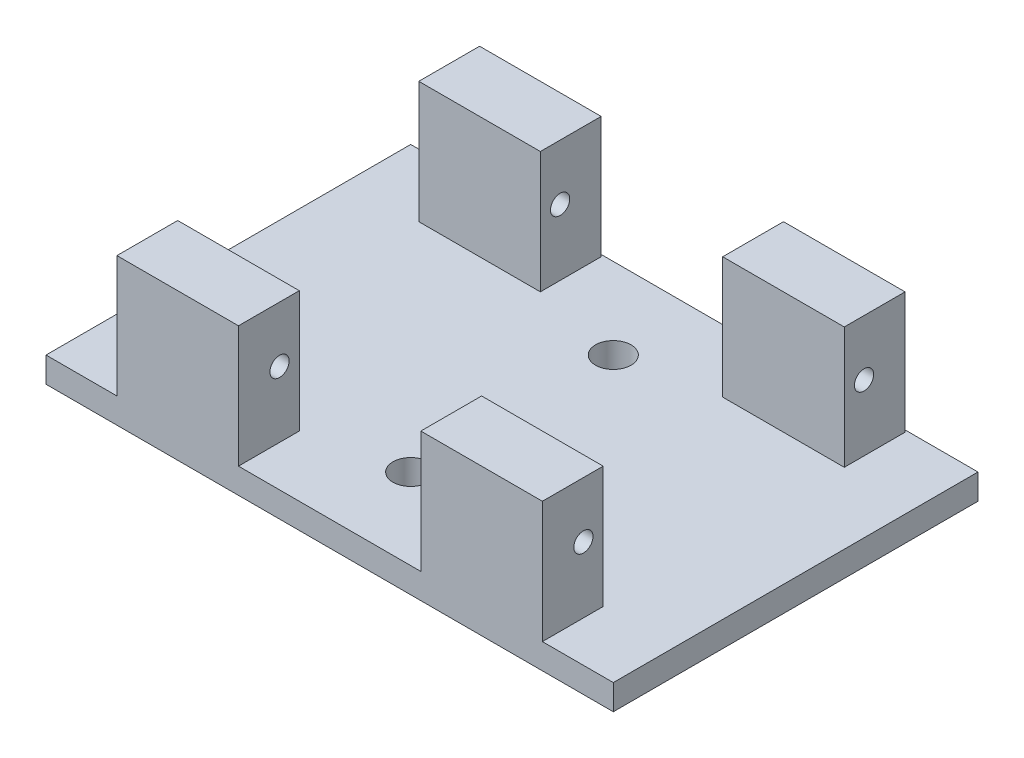
ISO-10303-21;
HEADER;
FILE_DESCRIPTION(('STEP AP214'),'2;1');
FILE_NAME('part.step','',(''),(''),'','','');
FILE_SCHEMA(('AUTOMOTIVE_DESIGN { 1 0 10303 214 1 1 1 1 }'));
ENDSEC;
DATA;
#1=APPLICATION_CONTEXT('core data for automotive mechanical design processes');
#2=APPLICATION_PROTOCOL_DEFINITION('international standard','automotive_design',2000,#1);
#3=PRODUCT_CONTEXT('',#1,'mechanical');
#4=PRODUCT('Part','Part','',(#3));
#5=PRODUCT_RELATED_PRODUCT_CATEGORY('part','',(#4));
#6=PRODUCT_DEFINITION_FORMATION('','',#4);
#7=PRODUCT_DEFINITION_CONTEXT('part definition',#1,'design');
#8=PRODUCT_DEFINITION('design','',#6,#7);
#9=PRODUCT_DEFINITION_SHAPE('','',#8);
#10=(LENGTH_UNIT() NAMED_UNIT(*) SI_UNIT(.MILLI.,.METRE.));
#11=(NAMED_UNIT(*) PLANE_ANGLE_UNIT() SI_UNIT($,.RADIAN.));
#12=(NAMED_UNIT(*) SI_UNIT($,.STERADIAN.) SOLID_ANGLE_UNIT());
#13=UNCERTAINTY_MEASURE_WITH_UNIT(LENGTH_MEASURE(1.E-05),#10,'distance_accuracy_value','');
#14=(GEOMETRIC_REPRESENTATION_CONTEXT(3) GLOBAL_UNCERTAINTY_ASSIGNED_CONTEXT((#13)) GLOBAL_UNIT_ASSIGNED_CONTEXT((#10,
#11,#12)) REPRESENTATION_CONTEXT('',''));
#15=CARTESIAN_POINT('',(0.,0.,0.));
#16=DIRECTION('',(0.,0.,1.));
#17=DIRECTION('',(1.,0.,0.));
#18=AXIS2_PLACEMENT_3D('',#15,#16,#17);
#19=CARTESIAN_POINT('',(0.,2.5,0.));
#20=DIRECTION('',(0.,1.,0.));
#21=DIRECTION('',(0.,0.,1.));
#22=AXIS2_PLACEMENT_3D('',#19,#20,#21);
#23=PLANE('',#22);
#24=CARTESIAN_POINT('',(0.,2.5,10.));
#25=DIRECTION('',(0.,1.,0.));
#26=DIRECTION('',(0.,0.,1.));
#27=AXIS2_PLACEMENT_3D('',#24,#25,#26);
#28=CIRCLE('',#27,1.75);
#29=CARTESIAN_POINT('',(0.,2.5,11.75));
#30=VERTEX_POINT('',#29);
#31=EDGE_CURVE('E691',#30,#30,#28,.T.);
#32=ORIENTED_EDGE('',*,*,#31,.F.);
#33=EDGE_LOOP('',(#32));
#34=FACE_BOUND('',#33,.T.);
#35=CARTESIAN_POINT('',(0.,2.5,-10.));
#36=DIRECTION('',(0.,1.,0.));
#37=DIRECTION('',(0.,0.,1.));
#38=AXIS2_PLACEMENT_3D('',#35,#36,#37);
#39=CIRCLE('',#38,1.75);
#40=CARTESIAN_POINT('',(0.,2.5,-8.25));
#41=VERTEX_POINT('',#40);
#42=EDGE_CURVE('E692',#41,#41,#39,.T.);
#43=ORIENTED_EDGE('',*,*,#42,.F.);
#44=EDGE_LOOP('',(#43));
#45=FACE_BOUND('',#44,.T.);
#46=DIRECTION('',(0.,0.,1.));
#47=VECTOR('',#46,1.);
#48=CARTESIAN_POINT('',(-9.,2.5,-17.8));
#49=LINE('',#48,#47);
#50=CARTESIAN_POINT('',(-9.,2.5,-17.8));
#51=VERTEX_POINT('',#50);
#52=CARTESIAN_POINT('',(-9.,2.5,-11.8));
#53=VERTEX_POINT('',#52);
#54=EDGE_CURVE('E183',#51,#53,#49,.T.);
#55=ORIENTED_EDGE('',*,*,#54,.T.);
#56=DIRECTION('',(-1.,0.,0.));
#57=VECTOR('',#56,1.);
#58=CARTESIAN_POINT('',(-9.,2.5,-11.8));
#59=LINE('',#58,#57);
#60=CARTESIAN_POINT('',(-21.,2.5,-11.8));
#61=VERTEX_POINT('',#60);
#62=EDGE_CURVE('E197',#53,#61,#59,.T.);
#63=ORIENTED_EDGE('',*,*,#62,.T.);
#64=DIRECTION('',(0.,0.,-1.));
#65=VECTOR('',#64,1.);
#66=CARTESIAN_POINT('',(-21.,2.5,-17.8));
#67=LINE('',#66,#65);
#68=CARTESIAN_POINT('',(-21.,2.5,-17.8));
#69=VERTEX_POINT('',#68);
#70=EDGE_CURVE('E61',#61,#69,#67,.T.);
#71=ORIENTED_EDGE('',*,*,#70,.T.);
#72=DIRECTION('',(1.,0.,0.));
#73=VECTOR('',#72,1.);
#74=CARTESIAN_POINT('',(-9.,2.5,-17.8));
#75=LINE('',#74,#73);
#76=EDGE_CURVE('E56',#69,#51,#75,.T.);
#77=ORIENTED_EDGE('',*,*,#76,.T.);
#78=EDGE_LOOP('',(#55,#63,#71,#77));
#79=FACE_BOUND('',#78,.T.);
#80=DIRECTION('',(0.,0.,1.));
#81=VECTOR('',#80,1.);
#82=CARTESIAN_POINT('',(-9.,2.5,12.));
#83=LINE('',#82,#81);
#84=CARTESIAN_POINT('',(-9.,2.5,12.));
#85=VERTEX_POINT('',#84);
#86=CARTESIAN_POINT('',(-9.,2.5,18.));
#87=VERTEX_POINT('',#86);
#88=EDGE_CURVE('E231',#85,#87,#83,.T.);
#89=ORIENTED_EDGE('',*,*,#88,.T.);
#90=DIRECTION('',(1.,0.,0.));
#91=VECTOR('',#90,1.);
#92=CARTESIAN_POINT('',(-28.,2.5,18.));
#93=LINE('',#92,#91);
#94=CARTESIAN_POINT('',(9.,2.5,18.));
#95=VERTEX_POINT('',#94);
#96=EDGE_CURVE('E331',#87,#95,#93,.T.);
#97=ORIENTED_EDGE('',*,*,#96,.T.);
#98=DIRECTION('',(0.,0.,1.));
#99=VECTOR('',#98,1.);
#100=CARTESIAN_POINT('',(9.,2.5,12.));
#101=LINE('',#100,#99);
#102=CARTESIAN_POINT('',(9.,2.5,12.));
#103=VERTEX_POINT('',#102);
#104=EDGE_CURVE('E275',#103,#95,#101,.T.);
#105=ORIENTED_EDGE('',*,*,#104,.F.);
#106=DIRECTION('',(-1.,0.,0.));
#107=VECTOR('',#106,1.);
#108=CARTESIAN_POINT('',(9.,2.5,12.));
#109=LINE('',#108,#107);
#110=CARTESIAN_POINT('',(21.,2.5,12.));
#111=VERTEX_POINT('',#110);
#112=EDGE_CURVE('E303',#111,#103,#109,.T.);
#113=ORIENTED_EDGE('',*,*,#112,.F.);
#114=DIRECTION('',(0.,0.,-1.));
#115=VECTOR('',#114,1.);
#116=CARTESIAN_POINT('',(21.,2.5,12.));
#117=LINE('',#116,#115);
#118=CARTESIAN_POINT('',(21.,2.5,18.));
#119=VERTEX_POINT('',#118);
#120=EDGE_CURVE('E306',#119,#111,#117,.T.);
#121=ORIENTED_EDGE('',*,*,#120,.F.);
#122=CARTESIAN_POINT('',(28.,2.5,18.));
#123=VERTEX_POINT('',#122);
#124=EDGE_CURVE('E327',#119,#123,#93,.T.);
#125=ORIENTED_EDGE('',*,*,#124,.T.);
#126=DIRECTION('',(0.,0.,-1.));
#127=VECTOR('',#126,1.);
#128=CARTESIAN_POINT('',(28.,2.5,-18.));
#129=LINE('',#128,#127);
#130=CARTESIAN_POINT('',(28.,2.5,-18.));
#131=VERTEX_POINT('',#130);
#132=EDGE_CURVE('E319',#123,#131,#129,.T.);
#133=ORIENTED_EDGE('',*,*,#132,.T.);
#134=DIRECTION('',(-1.,0.,0.));
#135=VECTOR('',#134,1.);
#136=CARTESIAN_POINT('',(-28.,2.5,-18.));
#137=LINE('',#136,#135);
#138=CARTESIAN_POINT('',(-28.,2.5,-18.));
#139=VERTEX_POINT('',#138);
#140=EDGE_CURVE('E322',#131,#139,#137,.T.);
#141=ORIENTED_EDGE('',*,*,#140,.T.);
#142=DIRECTION('',(0.,0.,1.));
#143=VECTOR('',#142,1.);
#144=CARTESIAN_POINT('',(-28.,2.5,-18.));
#145=LINE('',#144,#143);
#146=CARTESIAN_POINT('',(-28.,2.5,18.));
#147=VERTEX_POINT('',#146);
#148=EDGE_CURVE('E325',#139,#147,#145,.T.);
#149=ORIENTED_EDGE('',*,*,#148,.T.);
#150=CARTESIAN_POINT('',(-21.,2.5,18.));
#151=VERTEX_POINT('',#150);
#152=EDGE_CURVE('E328',#147,#151,#93,.T.);
#153=ORIENTED_EDGE('',*,*,#152,.T.);
#154=DIRECTION('',(0.,0.,-1.));
#155=VECTOR('',#154,1.);
#156=CARTESIAN_POINT('',(-21.,2.5,12.));
#157=LINE('',#156,#155);
#158=CARTESIAN_POINT('',(-21.,2.5,12.));
#159=VERTEX_POINT('',#158);
#160=EDGE_CURVE('E221',#151,#159,#157,.T.);
#161=ORIENTED_EDGE('',*,*,#160,.T.);
#162=DIRECTION('',(1.,0.,0.));
#163=VECTOR('',#162,1.);
#164=CARTESIAN_POINT('',(-9.,2.5,12.));
#165=LINE('',#164,#163);
#166=EDGE_CURVE('E234',#159,#85,#165,.T.);
#167=ORIENTED_EDGE('',*,*,#166,.T.);
#168=EDGE_LOOP('',(#89,#97,#105,#113,#121,#125,#133,#141,#149,#153,#161,#167));
#169=FACE_BOUND('',#168,.T.);
#170=DIRECTION('',(1.,0.,0.));
#171=VECTOR('',#170,1.);
#172=CARTESIAN_POINT('',(9.,2.5,-11.8));
#173=LINE('',#172,#171);
#174=CARTESIAN_POINT('',(9.,2.5,-11.8));
#175=VERTEX_POINT('',#174);
#176=CARTESIAN_POINT('',(21.,2.5,-11.8));
#177=VERTEX_POINT('',#176);
#178=EDGE_CURVE('E274',#175,#177,#173,.T.);
#179=ORIENTED_EDGE('',*,*,#178,.F.);
#180=DIRECTION('',(0.,0.,1.));
#181=VECTOR('',#180,1.);
#182=CARTESIAN_POINT('',(9.,2.5,-17.8));
#183=LINE('',#182,#181);
#184=CARTESIAN_POINT('',(9.,2.5,-17.8));
#185=VERTEX_POINT('',#184);
#186=EDGE_CURVE('E271',#185,#175,#183,.T.);
#187=ORIENTED_EDGE('',*,*,#186,.F.);
#188=DIRECTION('',(-1.,0.,0.));
#189=VECTOR('',#188,1.);
#190=CARTESIAN_POINT('',(9.,2.5,-17.8));
#191=LINE('',#190,#189);
#192=CARTESIAN_POINT('',(21.,2.5,-17.8));
#193=VERTEX_POINT('',#192);
#194=EDGE_CURVE('E264',#193,#185,#191,.T.);
#195=ORIENTED_EDGE('',*,*,#194,.F.);
#196=DIRECTION('',(0.,0.,-1.));
#197=VECTOR('',#196,1.);
#198=CARTESIAN_POINT('',(21.,2.5,-17.8));
#199=LINE('',#198,#197);
#200=EDGE_CURVE('E277',#177,#193,#199,.T.);
#201=ORIENTED_EDGE('',*,*,#200,.F.);
#202=EDGE_LOOP('',(#179,#187,#195,#201));
#203=FACE_BOUND('',#202,.T.);
#204=ADVANCED_FACE('F41',(#34,#45,#79,#169,#203),#23,.T.);
#205=CARTESIAN_POINT('',(28.,2.5,-18.));
#206=DIRECTION('',(-1.,0.,0.));
#207=DIRECTION('',(0.,0.,1.));
#208=AXIS2_PLACEMENT_3D('',#205,#206,#207);
#209=PLANE('',#208);
#210=DIRECTION('',(0.,0.,-1.));
#211=VECTOR('',#210,1.);
#212=CARTESIAN_POINT('',(28.,0.,-18.));
#213=LINE('',#212,#211);
#214=CARTESIAN_POINT('',(28.,0.,18.));
#215=VERTEX_POINT('',#214);
#216=CARTESIAN_POINT('',(28.,0.,-18.));
#217=VERTEX_POINT('',#216);
#218=EDGE_CURVE('E290',#215,#217,#213,.T.);
#219=ORIENTED_EDGE('',*,*,#218,.T.);
#220=DIRECTION('',(0.,-1.,0.));
#221=VECTOR('',#220,1.);
#222=CARTESIAN_POINT('',(28.,2.5,-18.));
#223=LINE('',#222,#221);
#224=EDGE_CURVE('E11',#131,#217,#223,.T.);
#225=ORIENTED_EDGE('',*,*,#224,.F.);
#226=ORIENTED_EDGE('',*,*,#132,.F.);
#227=DIRECTION('',(0.,-1.,0.));
#228=VECTOR('',#227,1.);
#229=CARTESIAN_POINT('',(28.,2.5,18.));
#230=LINE('',#229,#228);
#231=EDGE_CURVE('E330',#123,#215,#230,.T.);
#232=ORIENTED_EDGE('',*,*,#231,.T.);
#233=EDGE_LOOP('',(#219,#225,#226,#232));
#234=FACE_BOUND('',#233,.T.);
#235=ADVANCED_FACE('F43',(#234),#209,.F.);
#236=CARTESIAN_POINT('',(-28.,2.5,-18.));
#237=DIRECTION('',(0.,0.,1.));
#238=DIRECTION('',(1.,0.,0.));
#239=AXIS2_PLACEMENT_3D('',#236,#237,#238);
#240=PLANE('',#239);
#241=DIRECTION('',(-1.,0.,0.));
#242=VECTOR('',#241,1.);
#243=CARTESIAN_POINT('',(-28.,0.,-18.));
#244=LINE('',#243,#242);
#245=CARTESIAN_POINT('',(-28.,0.,-18.));
#246=VERTEX_POINT('',#245);
#247=EDGE_CURVE('E334',#217,#246,#244,.T.);
#248=ORIENTED_EDGE('',*,*,#247,.T.);
#249=DIRECTION('',(0.,-1.,0.));
#250=VECTOR('',#249,1.);
#251=CARTESIAN_POINT('',(-28.,2.5,-18.));
#252=LINE('',#251,#250);
#253=EDGE_CURVE('E49',#139,#246,#252,.T.);
#254=ORIENTED_EDGE('',*,*,#253,.F.);
#255=ORIENTED_EDGE('',*,*,#140,.F.);
#256=ORIENTED_EDGE('',*,*,#224,.T.);
#257=EDGE_LOOP('',(#248,#254,#255,#256));
#258=FACE_BOUND('',#257,.T.);
#259=ADVANCED_FACE('F401',(#258),#240,.F.);
#260=CARTESIAN_POINT('',(-28.,2.5,-18.));
#261=DIRECTION('',(1.,0.,0.));
#262=DIRECTION('',(0.,0.,-1.));
#263=AXIS2_PLACEMENT_3D('',#260,#261,#262);
#264=PLANE('',#263);
#265=DIRECTION('',(0.,0.,1.));
#266=VECTOR('',#265,1.);
#267=CARTESIAN_POINT('',(-28.,0.,-18.));
#268=LINE('',#267,#266);
#269=CARTESIAN_POINT('',(-28.,0.,18.));
#270=VERTEX_POINT('',#269);
#271=EDGE_CURVE('E336',#246,#270,#268,.T.);
#272=ORIENTED_EDGE('',*,*,#271,.T.);
#273=DIRECTION('',(0.,-1.,0.));
#274=VECTOR('',#273,1.);
#275=CARTESIAN_POINT('',(-28.,2.5,18.));
#276=LINE('',#275,#274);
#277=EDGE_CURVE('E341',#147,#270,#276,.T.);
#278=ORIENTED_EDGE('',*,*,#277,.F.);
#279=ORIENTED_EDGE('',*,*,#148,.F.);
#280=ORIENTED_EDGE('',*,*,#253,.T.);
#281=EDGE_LOOP('',(#272,#278,#279,#280));
#282=FACE_BOUND('',#281,.T.);
#283=ADVANCED_FACE('F348',(#282),#264,.F.);
#284=CARTESIAN_POINT('',(-28.,2.5,18.));
#285=DIRECTION('',(0.,0.,-1.));
#286=DIRECTION('',(-1.,0.,0.));
#287=AXIS2_PLACEMENT_3D('',#284,#285,#286);
#288=PLANE('',#287);
#289=DIRECTION('',(1.,0.,0.));
#290=VECTOR('',#289,1.);
#291=CARTESIAN_POINT('',(-28.,0.,18.));
#292=LINE('',#291,#290);
#293=EDGE_CURVE('E323',#270,#215,#292,.T.);
#294=ORIENTED_EDGE('',*,*,#293,.T.);
#295=ORIENTED_EDGE('',*,*,#231,.F.);
#296=ORIENTED_EDGE('',*,*,#124,.F.);
#297=DIRECTION('',(0.,-1.,0.));
#298=VECTOR('',#297,1.);
#299=CARTESIAN_POINT('',(21.,14.5,18.));
#300=LINE('',#299,#298);
#301=CARTESIAN_POINT('',(21.,14.5,18.));
#302=VERTEX_POINT('',#301);
#303=EDGE_CURVE('E293',#302,#119,#300,.T.);
#304=ORIENTED_EDGE('',*,*,#303,.F.);
#305=DIRECTION('',(1.,0.,0.));
#306=VECTOR('',#305,1.);
#307=CARTESIAN_POINT('',(9.,14.5,18.));
#308=LINE('',#307,#306);
#309=CARTESIAN_POINT('',(9.,14.5,18.));
#310=VERTEX_POINT('',#309);
#311=EDGE_CURVE('E315',#310,#302,#308,.T.);
#312=ORIENTED_EDGE('',*,*,#311,.F.);
#313=DIRECTION('',(0.,-1.,0.));
#314=VECTOR('',#313,1.);
#315=CARTESIAN_POINT('',(9.,14.5,18.));
#316=LINE('',#315,#314);
#317=EDGE_CURVE('E259',#310,#95,#316,.T.);
#318=ORIENTED_EDGE('',*,*,#317,.T.);
#319=ORIENTED_EDGE('',*,*,#96,.F.);
#320=DIRECTION('',(0.,-1.,0.));
#321=VECTOR('',#320,1.);
#322=CARTESIAN_POINT('',(-9.,14.5,18.));
#323=LINE('',#322,#321);
#324=CARTESIAN_POINT('',(-9.,14.5,18.));
#325=VERTEX_POINT('',#324);
#326=EDGE_CURVE('E230',#325,#87,#323,.T.);
#327=ORIENTED_EDGE('',*,*,#326,.F.);
#328=DIRECTION('',(-1.,0.,0.));
#329=VECTOR('',#328,1.);
#330=CARTESIAN_POINT('',(-9.,14.5,18.));
#331=LINE('',#330,#329);
#332=CARTESIAN_POINT('',(-21.,14.5,18.));
#333=VERTEX_POINT('',#332);
#334=EDGE_CURVE('E227',#325,#333,#331,.T.);
#335=ORIENTED_EDGE('',*,*,#334,.T.);
#336=DIRECTION('',(0.,-1.,0.));
#337=VECTOR('',#336,1.);
#338=CARTESIAN_POINT('',(-21.,14.5,18.));
#339=LINE('',#338,#337);
#340=EDGE_CURVE('E240',#333,#151,#339,.T.);
#341=ORIENTED_EDGE('',*,*,#340,.T.);
#342=ORIENTED_EDGE('',*,*,#152,.F.);
#343=ORIENTED_EDGE('',*,*,#277,.T.);
#344=EDGE_LOOP('',(#294,#295,#296,#304,#312,#318,#319,#327,#335,#341,#342,#343));
#345=FACE_BOUND('',#344,.T.);
#346=ADVANCED_FACE('F357',(#345),#288,.F.);
#347=CARTESIAN_POINT('',(0.,0.,0.));
#348=DIRECTION('',(0.,1.,0.));
#349=DIRECTION('',(0.,0.,1.));
#350=AXIS2_PLACEMENT_3D('',#347,#348,#349);
#351=PLANE('',#350);
#352=CARTESIAN_POINT('',(0.,0.,10.));
#353=DIRECTION('',(0.,1.,0.));
#354=DIRECTION('',(0.,0.,1.));
#355=AXIS2_PLACEMENT_3D('',#352,#353,#354);
#356=CIRCLE('',#355,1.75);
#357=CARTESIAN_POINT('',(0.,0.,11.75));
#358=VERTEX_POINT('',#357);
#359=EDGE_CURVE('E689',#358,#358,#356,.T.);
#360=ORIENTED_EDGE('',*,*,#359,.T.);
#361=EDGE_LOOP('',(#360));
#362=FACE_BOUND('',#361,.T.);
#363=CARTESIAN_POINT('',(0.,0.,-10.));
#364=DIRECTION('',(0.,1.,0.));
#365=DIRECTION('',(0.,0.,1.));
#366=AXIS2_PLACEMENT_3D('',#363,#364,#365);
#367=CIRCLE('',#366,1.75);
#368=CARTESIAN_POINT('',(0.,0.,-8.25));
#369=VERTEX_POINT('',#368);
#370=EDGE_CURVE('E697',#369,#369,#367,.T.);
#371=ORIENTED_EDGE('',*,*,#370,.T.);
#372=EDGE_LOOP('',(#371));
#373=FACE_BOUND('',#372,.T.);
#374=ORIENTED_EDGE('',*,*,#218,.F.);
#375=ORIENTED_EDGE('',*,*,#293,.F.);
#376=ORIENTED_EDGE('',*,*,#271,.F.);
#377=ORIENTED_EDGE('',*,*,#247,.F.);
#378=EDGE_LOOP('',(#374,#375,#376,#377));
#379=FACE_BOUND('',#378,.T.);
#380=ADVANCED_FACE('F354',(#362,#373,#379),#351,.F.);
#381=CARTESIAN_POINT('',(9.,14.5,-17.8));
#382=DIRECTION('',(1.,0.,0.));
#383=DIRECTION('',(0.,0.,-1.));
#384=AXIS2_PLACEMENT_3D('',#381,#382,#383);
#385=PLANE('',#384);
#386=CARTESIAN_POINT('',(9.,9.,-13.75));
#387=DIRECTION('',(1.,0.,0.));
#388=DIRECTION('',(0.,0.,-1.));
#389=AXIS2_PLACEMENT_3D('',#386,#387,#388);
#390=CIRCLE('',#389,0.949999999999999);
#391=CARTESIAN_POINT('',(9.,9.,-14.7));
#392=VERTEX_POINT('',#391);
#393=EDGE_CURVE('E256',#392,#392,#390,.T.);
#394=ORIENTED_EDGE('',*,*,#393,.T.);
#395=EDGE_LOOP('',(#394));
#396=FACE_BOUND('',#395,.T.);
#397=ORIENTED_EDGE('',*,*,#186,.T.);
#398=DIRECTION('',(0.,-1.,0.));
#399=VECTOR('',#398,1.);
#400=CARTESIAN_POINT('',(9.,14.5,-11.8));
#401=LINE('',#400,#399);
#402=CARTESIAN_POINT('',(9.,14.5,-11.8));
#403=VERTEX_POINT('',#402);
#404=EDGE_CURVE('E288',#403,#175,#401,.T.);
#405=ORIENTED_EDGE('',*,*,#404,.F.);
#406=DIRECTION('',(0.,0.,1.));
#407=VECTOR('',#406,1.);
#408=CARTESIAN_POINT('',(9.,14.5,-17.8));
#409=LINE('',#408,#407);
#410=CARTESIAN_POINT('',(9.,14.5,-17.8));
#411=VERTEX_POINT('',#410);
#412=EDGE_CURVE('E260',#411,#403,#409,.T.);
#413=ORIENTED_EDGE('',*,*,#412,.F.);
#414=DIRECTION('',(0.,-1.,0.));
#415=VECTOR('',#414,1.);
#416=CARTESIAN_POINT('',(9.,14.5,-17.8));
#417=LINE('',#416,#415);
#418=EDGE_CURVE('E270',#411,#185,#417,.T.);
#419=ORIENTED_EDGE('',*,*,#418,.T.);
#420=EDGE_LOOP('',(#397,#405,#413,#419));
#421=FACE_BOUND('',#420,.T.);
#422=ADVANCED_FACE('F406',(#396,#421),#385,.F.);
#423=CARTESIAN_POINT('',(9.,14.5,-11.8));
#424=DIRECTION('',(0.,0.,-1.));
#425=DIRECTION('',(-1.,0.,0.));
#426=AXIS2_PLACEMENT_3D('',#423,#424,#425);
#427=PLANE('',#426);
#428=ORIENTED_EDGE('',*,*,#178,.T.);
#429=DIRECTION('',(0.,-1.,0.));
#430=VECTOR('',#429,1.);
#431=CARTESIAN_POINT('',(21.,14.5,-11.8));
#432=LINE('',#431,#430);
#433=CARTESIAN_POINT('',(21.,14.5,-11.8));
#434=VERTEX_POINT('',#433);
#435=EDGE_CURVE('E285',#434,#177,#432,.T.);
#436=ORIENTED_EDGE('',*,*,#435,.F.);
#437=DIRECTION('',(1.,0.,0.));
#438=VECTOR('',#437,1.);
#439=CARTESIAN_POINT('',(9.,14.5,-11.8));
#440=LINE('',#439,#438);
#441=EDGE_CURVE('E263',#403,#434,#440,.T.);
#442=ORIENTED_EDGE('',*,*,#441,.F.);
#443=ORIENTED_EDGE('',*,*,#404,.T.);
#444=EDGE_LOOP('',(#428,#436,#442,#443));
#445=FACE_BOUND('',#444,.T.);
#446=ADVANCED_FACE('F426',(#445),#427,.F.);
#447=CARTESIAN_POINT('',(21.,14.5,-17.8));
#448=DIRECTION('',(-1.,0.,0.));
#449=DIRECTION('',(0.,0.,1.));
#450=AXIS2_PLACEMENT_3D('',#447,#448,#449);
#451=PLANE('',#450);
#452=CARTESIAN_POINT('',(21.,9.,-13.75));
#453=DIRECTION('',(1.,0.,0.));
#454=DIRECTION('',(0.,0.,-1.));
#455=AXIS2_PLACEMENT_3D('',#452,#453,#454);
#456=CIRCLE('',#455,0.949999999999999);
#457=CARTESIAN_POINT('',(21.,9.,-14.7));
#458=VERTEX_POINT('',#457);
#459=EDGE_CURVE('E186',#458,#458,#456,.T.);
#460=ORIENTED_EDGE('',*,*,#459,.F.);
#461=EDGE_LOOP('',(#460));
#462=FACE_BOUND('',#461,.T.);
#463=ORIENTED_EDGE('',*,*,#200,.T.);
#464=DIRECTION('',(0.,-1.,0.));
#465=VECTOR('',#464,1.);
#466=CARTESIAN_POINT('',(21.,14.5,-17.8));
#467=LINE('',#466,#465);
#468=CARTESIAN_POINT('',(21.,14.5,-17.8));
#469=VERTEX_POINT('',#468);
#470=EDGE_CURVE('E283',#469,#193,#467,.T.);
#471=ORIENTED_EDGE('',*,*,#470,.F.);
#472=DIRECTION('',(0.,0.,-1.));
#473=VECTOR('',#472,1.);
#474=CARTESIAN_POINT('',(21.,14.5,-17.8));
#475=LINE('',#474,#473);
#476=EDGE_CURVE('E266',#434,#469,#475,.T.);
#477=ORIENTED_EDGE('',*,*,#476,.F.);
#478=ORIENTED_EDGE('',*,*,#435,.T.);
#479=EDGE_LOOP('',(#463,#471,#477,#478));
#480=FACE_BOUND('',#479,.T.);
#481=ADVANCED_FACE('F430',(#462,#480),#451,.F.);
#482=CARTESIAN_POINT('',(9.,14.5,-17.8));
#483=DIRECTION('',(0.,0.,1.));
#484=DIRECTION('',(1.,0.,0.));
#485=AXIS2_PLACEMENT_3D('',#482,#483,#484);
#486=PLANE('',#485);
#487=ORIENTED_EDGE('',*,*,#194,.T.);
#488=ORIENTED_EDGE('',*,*,#418,.F.);
#489=DIRECTION('',(-1.,0.,0.));
#490=VECTOR('',#489,1.);
#491=CARTESIAN_POINT('',(9.,14.5,-17.8));
#492=LINE('',#491,#490);
#493=EDGE_CURVE('E268',#469,#411,#492,.T.);
#494=ORIENTED_EDGE('',*,*,#493,.F.);
#495=ORIENTED_EDGE('',*,*,#470,.T.);
#496=EDGE_LOOP('',(#487,#488,#494,#495));
#497=FACE_BOUND('',#496,.T.);
#498=ADVANCED_FACE('F438',(#497),#486,.F.);
#499=CARTESIAN_POINT('',(0.,14.5,0.));
#500=DIRECTION('',(0.,1.,0.));
#501=DIRECTION('',(0.,0.,1.));
#502=AXIS2_PLACEMENT_3D('',#499,#500,#501);
#503=PLANE('',#502);
#504=ORIENTED_EDGE('',*,*,#412,.T.);
#505=ORIENTED_EDGE('',*,*,#441,.T.);
#506=ORIENTED_EDGE('',*,*,#476,.T.);
#507=ORIENTED_EDGE('',*,*,#493,.T.);
#508=EDGE_LOOP('',(#504,#505,#506,#507));
#509=FACE_BOUND('',#508,.T.);
#510=ADVANCED_FACE('F442',(#509),#503,.T.);
#511=CARTESIAN_POINT('',(9.,14.5,12.));
#512=DIRECTION('',(1.,0.,0.));
#513=DIRECTION('',(0.,0.,-1.));
#514=AXIS2_PLACEMENT_3D('',#511,#512,#513);
#515=PLANE('',#514);
#516=CARTESIAN_POINT('',(9.,9.,13.95));
#517=DIRECTION('',(1.,0.,0.));
#518=DIRECTION('',(0.,0.,-1.));
#519=AXIS2_PLACEMENT_3D('',#516,#517,#518);
#520=CIRCLE('',#519,0.949999999999999);
#521=CARTESIAN_POINT('',(9.,9.,13.));
#522=VERTEX_POINT('',#521);
#523=EDGE_CURVE('E251',#522,#522,#520,.T.);
#524=ORIENTED_EDGE('',*,*,#523,.T.);
#525=EDGE_LOOP('',(#524));
#526=FACE_BOUND('',#525,.T.);
#527=ORIENTED_EDGE('',*,*,#104,.T.);
#528=ORIENTED_EDGE('',*,*,#317,.F.);
#529=DIRECTION('',(0.,0.,1.));
#530=VECTOR('',#529,1.);
#531=CARTESIAN_POINT('',(9.,14.5,12.));
#532=LINE('',#531,#530);
#533=CARTESIAN_POINT('',(9.,14.5,12.));
#534=VERTEX_POINT('',#533);
#535=EDGE_CURVE('E307',#534,#310,#532,.T.);
#536=ORIENTED_EDGE('',*,*,#535,.F.);
#537=DIRECTION('',(0.,-1.,0.));
#538=VECTOR('',#537,1.);
#539=CARTESIAN_POINT('',(9.,14.5,12.));
#540=LINE('',#539,#538);
#541=EDGE_CURVE('E299',#534,#103,#540,.T.);
#542=ORIENTED_EDGE('',*,*,#541,.T.);
#543=EDGE_LOOP('',(#527,#528,#536,#542));
#544=FACE_BOUND('',#543,.T.);
#545=ADVANCED_FACE('F370',(#526,#544),#515,.F.);
#546=CARTESIAN_POINT('',(21.,14.5,12.));
#547=DIRECTION('',(-1.,0.,0.));
#548=DIRECTION('',(0.,0.,1.));
#549=AXIS2_PLACEMENT_3D('',#546,#547,#548);
#550=PLANE('',#549);
#551=CARTESIAN_POINT('',(21.,9.,13.95));
#552=DIRECTION('',(1.,0.,0.));
#553=DIRECTION('',(0.,0.,-1.));
#554=AXIS2_PLACEMENT_3D('',#551,#552,#553);
#555=CIRCLE('',#554,0.949999999999999);
#556=CARTESIAN_POINT('',(21.,9.,13.));
#557=VERTEX_POINT('',#556);
#558=EDGE_CURVE('E248',#557,#557,#555,.T.);
#559=ORIENTED_EDGE('',*,*,#558,.F.);
#560=EDGE_LOOP('',(#559));
#561=FACE_BOUND('',#560,.T.);
#562=ORIENTED_EDGE('',*,*,#120,.T.);
#563=DIRECTION('',(0.,-1.,0.));
#564=VECTOR('',#563,1.);
#565=CARTESIAN_POINT('',(21.,14.5,12.));
#566=LINE('',#565,#564);
#567=CARTESIAN_POINT('',(21.,14.5,12.));
#568=VERTEX_POINT('',#567);
#569=EDGE_CURVE('E296',#568,#111,#566,.T.);
#570=ORIENTED_EDGE('',*,*,#569,.F.);
#571=DIRECTION('',(0.,0.,-1.));
#572=VECTOR('',#571,1.);
#573=CARTESIAN_POINT('',(21.,14.5,12.));
#574=LINE('',#573,#572);
#575=EDGE_CURVE('E313',#302,#568,#574,.T.);
#576=ORIENTED_EDGE('',*,*,#575,.F.);
#577=ORIENTED_EDGE('',*,*,#303,.T.);
#578=EDGE_LOOP('',(#562,#570,#576,#577));
#579=FACE_BOUND('',#578,.T.);
#580=ADVANCED_FACE('F377',(#561,#579),#550,.F.);
#581=CARTESIAN_POINT('',(9.,14.5,12.));
#582=DIRECTION('',(0.,0.,1.));
#583=DIRECTION('',(1.,0.,0.));
#584=AXIS2_PLACEMENT_3D('',#581,#582,#583);
#585=PLANE('',#584);
#586=ORIENTED_EDGE('',*,*,#112,.T.);
#587=ORIENTED_EDGE('',*,*,#541,.F.);
#588=DIRECTION('',(-1.,0.,0.));
#589=VECTOR('',#588,1.);
#590=CARTESIAN_POINT('',(9.,14.5,12.));
#591=LINE('',#590,#589);
#592=EDGE_CURVE('E302',#568,#534,#591,.T.);
#593=ORIENTED_EDGE('',*,*,#592,.F.);
#594=ORIENTED_EDGE('',*,*,#569,.T.);
#595=EDGE_LOOP('',(#586,#587,#593,#594));
#596=FACE_BOUND('',#595,.T.);
#597=ADVANCED_FACE('F374',(#596),#585,.F.);
#598=CARTESIAN_POINT('',(0.,14.5,0.));
#599=DIRECTION('',(0.,1.,0.));
#600=DIRECTION('',(0.,0.,1.));
#601=AXIS2_PLACEMENT_3D('',#598,#599,#600);
#602=PLANE('',#601);
#603=ORIENTED_EDGE('',*,*,#535,.T.);
#604=ORIENTED_EDGE('',*,*,#311,.T.);
#605=ORIENTED_EDGE('',*,*,#575,.T.);
#606=ORIENTED_EDGE('',*,*,#592,.T.);
#607=EDGE_LOOP('',(#603,#604,#605,#606));
#608=FACE_BOUND('',#607,.T.);
#609=ADVANCED_FACE('F380',(#608),#602,.T.);
#610=CARTESIAN_POINT('',(-28.,9.,13.95));
#611=DIRECTION('',(1.,0.,0.));
#612=DIRECTION('',(0.,0.,-1.));
#613=AXIS2_PLACEMENT_3D('',#610,#611,#612);
#614=CYLINDRICAL_SURFACE('',#613,0.949999999999999);
#615=ORIENTED_EDGE('',*,*,#558,.T.);
#616=EDGE_LOOP('',(#615));
#617=FACE_BOUND('',#616,.T.);
#618=ORIENTED_EDGE('',*,*,#523,.F.);
#619=EDGE_LOOP('',(#618));
#620=FACE_BOUND('',#619,.T.);
#621=ADVANCED_FACE('F382',(#617,#620),#614,.F.);
#622=CARTESIAN_POINT('',(-28.,9.,-13.75));
#623=DIRECTION('',(1.,0.,0.));
#624=DIRECTION('',(0.,0.,-1.));
#625=AXIS2_PLACEMENT_3D('',#622,#623,#624);
#626=CYLINDRICAL_SURFACE('',#625,0.949999999999999);
#627=ORIENTED_EDGE('',*,*,#459,.T.);
#628=EDGE_LOOP('',(#627));
#629=FACE_BOUND('',#628,.T.);
#630=ORIENTED_EDGE('',*,*,#393,.F.);
#631=EDGE_LOOP('',(#630));
#632=FACE_BOUND('',#631,.T.);
#633=ADVANCED_FACE('F389',(#629,#632),#626,.F.);
#634=CARTESIAN_POINT('',(-9.,14.5,12.));
#635=DIRECTION('',(1.,0.,0.));
#636=DIRECTION('',(0.,0.,-1.));
#637=AXIS2_PLACEMENT_3D('',#634,#635,#636);
#638=PLANE('',#637);
#639=CARTESIAN_POINT('',(-9.,9.,13.95));
#640=DIRECTION('',(1.,0.,0.));
#641=DIRECTION('',(0.,0.,-1.));
#642=AXIS2_PLACEMENT_3D('',#639,#640,#641);
#643=CIRCLE('',#642,0.949999999999999);
#644=CARTESIAN_POINT('',(-9.,9.,13.));
#645=VERTEX_POINT('',#644);
#646=EDGE_CURVE('E235',#645,#645,#643,.F.);
#647=ORIENTED_EDGE('',*,*,#646,.T.);
#648=EDGE_LOOP('',(#647));
#649=FACE_BOUND('',#648,.T.);
#650=ORIENTED_EDGE('',*,*,#88,.F.);
#651=DIRECTION('',(0.,-1.,0.));
#652=VECTOR('',#651,1.);
#653=CARTESIAN_POINT('',(-9.,14.5,12.));
#654=LINE('',#653,#652);
#655=CARTESIAN_POINT('',(-9.,14.5,12.));
#656=VERTEX_POINT('',#655);
#657=EDGE_CURVE('E208',#656,#85,#654,.T.);
#658=ORIENTED_EDGE('',*,*,#657,.F.);
#659=DIRECTION('',(0.,0.,1.));
#660=VECTOR('',#659,1.);
#661=CARTESIAN_POINT('',(-9.,14.5,12.));
#662=LINE('',#661,#660);
#663=EDGE_CURVE('E217',#656,#325,#662,.T.);
#664=ORIENTED_EDGE('',*,*,#663,.T.);
#665=ORIENTED_EDGE('',*,*,#326,.T.);
#666=EDGE_LOOP('',(#650,#658,#664,#665));
#667=FACE_BOUND('',#666,.T.);
#668=ADVANCED_FACE('F483',(#649,#667),#638,.T.);
#669=CARTESIAN_POINT('',(-9.,14.5,12.));
#670=DIRECTION('',(0.,0.,-1.));
#671=DIRECTION('',(-1.,0.,0.));
#672=AXIS2_PLACEMENT_3D('',#669,#670,#671);
#673=PLANE('',#672);
#674=ORIENTED_EDGE('',*,*,#166,.F.);
#675=DIRECTION('',(0.,-1.,0.));
#676=VECTOR('',#675,1.);
#677=CARTESIAN_POINT('',(-21.,14.5,12.));
#678=LINE('',#677,#676);
#679=CARTESIAN_POINT('',(-21.,14.5,12.));
#680=VERTEX_POINT('',#679);
#681=EDGE_CURVE('E243',#680,#159,#678,.T.);
#682=ORIENTED_EDGE('',*,*,#681,.F.);
#683=DIRECTION('',(1.,0.,0.));
#684=VECTOR('',#683,1.);
#685=CARTESIAN_POINT('',(-9.,14.5,12.));
#686=LINE('',#685,#684);
#687=EDGE_CURVE('E220',#680,#656,#686,.T.);
#688=ORIENTED_EDGE('',*,*,#687,.T.);
#689=ORIENTED_EDGE('',*,*,#657,.T.);
#690=EDGE_LOOP('',(#674,#682,#688,#689));
#691=FACE_BOUND('',#690,.T.);
#692=ADVANCED_FACE('F501',(#691),#673,.T.);
#693=CARTESIAN_POINT('',(-21.,14.5,12.));
#694=DIRECTION('',(-1.,0.,0.));
#695=DIRECTION('',(0.,0.,1.));
#696=AXIS2_PLACEMENT_3D('',#693,#694,#695);
#697=PLANE('',#696);
#698=CARTESIAN_POINT('',(-21.,9.,13.95));
#699=DIRECTION('',(1.,0.,0.));
#700=DIRECTION('',(0.,0.,-1.));
#701=AXIS2_PLACEMENT_3D('',#698,#699,#700);
#702=CIRCLE('',#701,0.949999999999999);
#703=CARTESIAN_POINT('',(-21.,9.,13.));
#704=VERTEX_POINT('',#703);
#705=EDGE_CURVE('E702',#704,#704,#702,.T.);
#706=ORIENTED_EDGE('',*,*,#705,.T.);
#707=EDGE_LOOP('',(#706));
#708=FACE_BOUND('',#707,.T.);
#709=ORIENTED_EDGE('',*,*,#160,.F.);
#710=ORIENTED_EDGE('',*,*,#340,.F.);
#711=DIRECTION('',(0.,0.,-1.));
#712=VECTOR('',#711,1.);
#713=CARTESIAN_POINT('',(-21.,14.5,12.));
#714=LINE('',#713,#712);
#715=EDGE_CURVE('E224',#333,#680,#714,.T.);
#716=ORIENTED_EDGE('',*,*,#715,.T.);
#717=ORIENTED_EDGE('',*,*,#681,.T.);
#718=EDGE_LOOP('',(#709,#710,#716,#717));
#719=FACE_BOUND('',#718,.T.);
#720=ADVANCED_FACE('F511',(#708,#719),#697,.T.);
#721=CARTESIAN_POINT('',(0.,14.5,0.));
#722=DIRECTION('',(0.,1.,0.));
#723=DIRECTION('',(0.,0.,1.));
#724=AXIS2_PLACEMENT_3D('',#721,#722,#723);
#725=PLANE('',#724);
#726=ORIENTED_EDGE('',*,*,#663,.F.);
#727=ORIENTED_EDGE('',*,*,#687,.F.);
#728=ORIENTED_EDGE('',*,*,#715,.F.);
#729=ORIENTED_EDGE('',*,*,#334,.F.);
#730=EDGE_LOOP('',(#726,#727,#728,#729));
#731=FACE_BOUND('',#730,.T.);
#732=ADVANCED_FACE('F521',(#731),#725,.T.);
#733=CARTESIAN_POINT('',(-9.,14.5,-17.8));
#734=DIRECTION('',(1.,0.,0.));
#735=DIRECTION('',(0.,0.,-1.));
#736=AXIS2_PLACEMENT_3D('',#733,#734,#735);
#737=PLANE('',#736);
#738=CARTESIAN_POINT('',(-8.99999999999999,9.,-13.75));
#739=DIRECTION('',(1.,0.,0.));
#740=DIRECTION('',(0.,0.,-1.));
#741=AXIS2_PLACEMENT_3D('',#738,#739,#740);
#742=CIRCLE('',#741,0.949999999999999);
#743=CARTESIAN_POINT('',(-8.99999999999999,9.,-14.7));
#744=VERTEX_POINT('',#743);
#745=EDGE_CURVE('E705',#744,#744,#742,.F.);
#746=ORIENTED_EDGE('',*,*,#745,.T.);
#747=EDGE_LOOP('',(#746));
#748=FACE_BOUND('',#747,.T.);
#749=ORIENTED_EDGE('',*,*,#54,.F.);
#750=DIRECTION('',(0.,-1.,0.));
#751=VECTOR('',#750,1.);
#752=CARTESIAN_POINT('',(-9.,14.5,-17.8));
#753=LINE('',#752,#751);
#754=CARTESIAN_POINT('',(-9.,14.5,-17.8));
#755=VERTEX_POINT('',#754);
#756=EDGE_CURVE('E177',#755,#51,#753,.T.);
#757=ORIENTED_EDGE('',*,*,#756,.F.);
#758=DIRECTION('',(0.,0.,1.));
#759=VECTOR('',#758,1.);
#760=CARTESIAN_POINT('',(-9.,14.5,-17.8));
#761=LINE('',#760,#759);
#762=CARTESIAN_POINT('',(-9.,14.5,-11.8));
#763=VERTEX_POINT('',#762);
#764=EDGE_CURVE('E181',#755,#763,#761,.T.);
#765=ORIENTED_EDGE('',*,*,#764,.T.);
#766=DIRECTION('',(0.,-1.,0.));
#767=VECTOR('',#766,1.);
#768=CARTESIAN_POINT('',(-9.,14.5,-11.8));
#769=LINE('',#768,#767);
#770=EDGE_CURVE('E206',#763,#53,#769,.T.);
#771=ORIENTED_EDGE('',*,*,#770,.T.);
#772=EDGE_LOOP('',(#749,#757,#765,#771));
#773=FACE_BOUND('',#772,.T.);
#774=ADVANCED_FACE('F179',(#748,#773),#737,.T.);
#775=CARTESIAN_POINT('',(-9.,14.5,-17.8));
#776=DIRECTION('',(0.,0.,-1.));
#777=DIRECTION('',(-1.,0.,0.));
#778=AXIS2_PLACEMENT_3D('',#775,#776,#777);
#779=PLANE('',#778);
#780=ORIENTED_EDGE('',*,*,#76,.F.);
#781=DIRECTION('',(0.,-1.,0.));
#782=VECTOR('',#781,1.);
#783=CARTESIAN_POINT('',(-21.,14.5,-17.8));
#784=LINE('',#783,#782);
#785=CARTESIAN_POINT('',(-21.,14.5,-17.8));
#786=VERTEX_POINT('',#785);
#787=EDGE_CURVE('E187',#786,#69,#784,.T.);
#788=ORIENTED_EDGE('',*,*,#787,.F.);
#789=DIRECTION('',(1.,0.,0.));
#790=VECTOR('',#789,1.);
#791=CARTESIAN_POINT('',(-9.,14.5,-17.8));
#792=LINE('',#791,#790);
#793=EDGE_CURVE('E193',#786,#755,#792,.T.);
#794=ORIENTED_EDGE('',*,*,#793,.T.);
#795=ORIENTED_EDGE('',*,*,#756,.T.);
#796=EDGE_LOOP('',(#780,#788,#794,#795));
#797=FACE_BOUND('',#796,.T.);
#798=ADVANCED_FACE('F199',(#797),#779,.T.);
#799=CARTESIAN_POINT('',(-21.,14.5,-17.8));
#800=DIRECTION('',(-1.,0.,0.));
#801=DIRECTION('',(0.,0.,1.));
#802=AXIS2_PLACEMENT_3D('',#799,#800,#801);
#803=PLANE('',#802);
#804=CARTESIAN_POINT('',(-21.,9.,-13.75));
#805=DIRECTION('',(1.,0.,0.));
#806=DIRECTION('',(0.,0.,-1.));
#807=AXIS2_PLACEMENT_3D('',#804,#805,#806);
#808=CIRCLE('',#807,0.949999999999999);
#809=CARTESIAN_POINT('',(-21.,9.,-14.7));
#810=VERTEX_POINT('',#809);
#811=EDGE_CURVE('E694',#810,#810,#808,.T.);
#812=ORIENTED_EDGE('',*,*,#811,.T.);
#813=EDGE_LOOP('',(#812));
#814=FACE_BOUND('',#813,.T.);
#815=ORIENTED_EDGE('',*,*,#70,.F.);
#816=DIRECTION('',(0.,-1.,0.));
#817=VECTOR('',#816,1.);
#818=CARTESIAN_POINT('',(-21.,14.5,-11.8));
#819=LINE('',#818,#817);
#820=CARTESIAN_POINT('',(-21.,14.5,-11.8));
#821=VERTEX_POINT('',#820);
#822=EDGE_CURVE('E213',#821,#61,#819,.T.);
#823=ORIENTED_EDGE('',*,*,#822,.F.);
#824=DIRECTION('',(0.,0.,-1.));
#825=VECTOR('',#824,1.);
#826=CARTESIAN_POINT('',(-21.,14.5,-17.8));
#827=LINE('',#826,#825);
#828=EDGE_CURVE('E200',#821,#786,#827,.T.);
#829=ORIENTED_EDGE('',*,*,#828,.T.);
#830=ORIENTED_EDGE('',*,*,#787,.T.);
#831=EDGE_LOOP('',(#815,#823,#829,#830));
#832=FACE_BOUND('',#831,.T.);
#833=ADVANCED_FACE('F549',(#814,#832),#803,.T.);
#834=CARTESIAN_POINT('',(-9.,14.5,-11.8));
#835=DIRECTION('',(0.,0.,1.));
#836=DIRECTION('',(1.,0.,0.));
#837=AXIS2_PLACEMENT_3D('',#834,#835,#836);
#838=PLANE('',#837);
#839=ORIENTED_EDGE('',*,*,#62,.F.);
#840=ORIENTED_EDGE('',*,*,#770,.F.);
#841=DIRECTION('',(-1.,0.,0.));
#842=VECTOR('',#841,1.);
#843=CARTESIAN_POINT('',(-9.,14.5,-11.8));
#844=LINE('',#843,#842);
#845=EDGE_CURVE('E196',#763,#821,#844,.T.);
#846=ORIENTED_EDGE('',*,*,#845,.T.);
#847=ORIENTED_EDGE('',*,*,#822,.T.);
#848=EDGE_LOOP('',(#839,#840,#846,#847));
#849=FACE_BOUND('',#848,.T.);
#850=ADVANCED_FACE('F558',(#849),#838,.T.);
#851=CARTESIAN_POINT('',(0.,14.5,0.));
#852=DIRECTION('',(0.,1.,0.));
#853=DIRECTION('',(0.,0.,1.));
#854=AXIS2_PLACEMENT_3D('',#851,#852,#853);
#855=PLANE('',#854);
#856=ORIENTED_EDGE('',*,*,#764,.F.);
#857=ORIENTED_EDGE('',*,*,#793,.F.);
#858=ORIENTED_EDGE('',*,*,#828,.F.);
#859=ORIENTED_EDGE('',*,*,#845,.F.);
#860=EDGE_LOOP('',(#856,#857,#858,#859));
#861=FACE_BOUND('',#860,.T.);
#862=ADVANCED_FACE('F191',(#861),#855,.T.);
#863=CARTESIAN_POINT('',(28.,9.,-13.75));
#864=DIRECTION('',(-1.,0.,0.));
#865=DIRECTION('',(0.,0.,1.));
#866=AXIS2_PLACEMENT_3D('',#863,#864,#865);
#867=CYLINDRICAL_SURFACE('',#866,0.949999999999999);
#868=ORIENTED_EDGE('',*,*,#745,.F.);
#869=EDGE_LOOP('',(#868));
#870=FACE_BOUND('',#869,.T.);
#871=ORIENTED_EDGE('',*,*,#811,.F.);
#872=EDGE_LOOP('',(#871));
#873=FACE_BOUND('',#872,.T.);
#874=ADVANCED_FACE('F577',(#870,#873),#867,.F.);
#875=CARTESIAN_POINT('',(28.,9.,13.95));
#876=DIRECTION('',(-1.,0.,0.));
#877=DIRECTION('',(0.,0.,1.));
#878=AXIS2_PLACEMENT_3D('',#875,#876,#877);
#879=CYLINDRICAL_SURFACE('',#878,0.949999999999999);
#880=ORIENTED_EDGE('',*,*,#646,.F.);
#881=EDGE_LOOP('',(#880));
#882=FACE_BOUND('',#881,.T.);
#883=ORIENTED_EDGE('',*,*,#705,.F.);
#884=EDGE_LOOP('',(#883));
#885=FACE_BOUND('',#884,.T.);
#886=ADVANCED_FACE('F586',(#882,#885),#879,.F.);
#887=CARTESIAN_POINT('',(0.,0.,-10.));
#888=DIRECTION('',(0.,1.,0.));
#889=DIRECTION('',(0.,0.,1.));
#890=AXIS2_PLACEMENT_3D('',#887,#888,#889);
#891=CYLINDRICAL_SURFACE('',#890,1.75);
#892=ORIENTED_EDGE('',*,*,#370,.F.);
#893=EDGE_LOOP('',(#892));
#894=FACE_BOUND('',#893,.T.);
#895=ORIENTED_EDGE('',*,*,#42,.T.);
#896=EDGE_LOOP('',(#895));
#897=FACE_BOUND('',#896,.T.);
#898=ADVANCED_FACE('F595',(#894,#897),#891,.F.);
#899=CARTESIAN_POINT('',(0.,0.,10.));
#900=DIRECTION('',(0.,1.,0.));
#901=DIRECTION('',(0.,0.,1.));
#902=AXIS2_PLACEMENT_3D('',#899,#900,#901);
#903=CYLINDRICAL_SURFACE('',#902,1.75);
#904=ORIENTED_EDGE('',*,*,#359,.F.);
#905=EDGE_LOOP('',(#904));
#906=FACE_BOUND('',#905,.T.);
#907=ORIENTED_EDGE('',*,*,#31,.T.);
#908=EDGE_LOOP('',(#907));
#909=FACE_BOUND('',#908,.T.);
#910=ADVANCED_FACE('F605',(#906,#909),#903,.F.);
#911=CLOSED_SHELL('',(#204,#235,#259,#283,#346,#380,#422,#446,#481,#498,#510,#545,#580,#597,
#609,#621,#633,#668,#692,#720,#732,#774,#798,#833,#850,#862,#874,#886,#898,#910));
#912=MANIFOLD_SOLID_BREP('B2',#911);
#913=ADVANCED_BREP_SHAPE_REPRESENTATION('',(#18,#912),#14);
#914=SHAPE_DEFINITION_REPRESENTATION(#9,#913);
ENDSEC;
END-ISO-10303-21;
